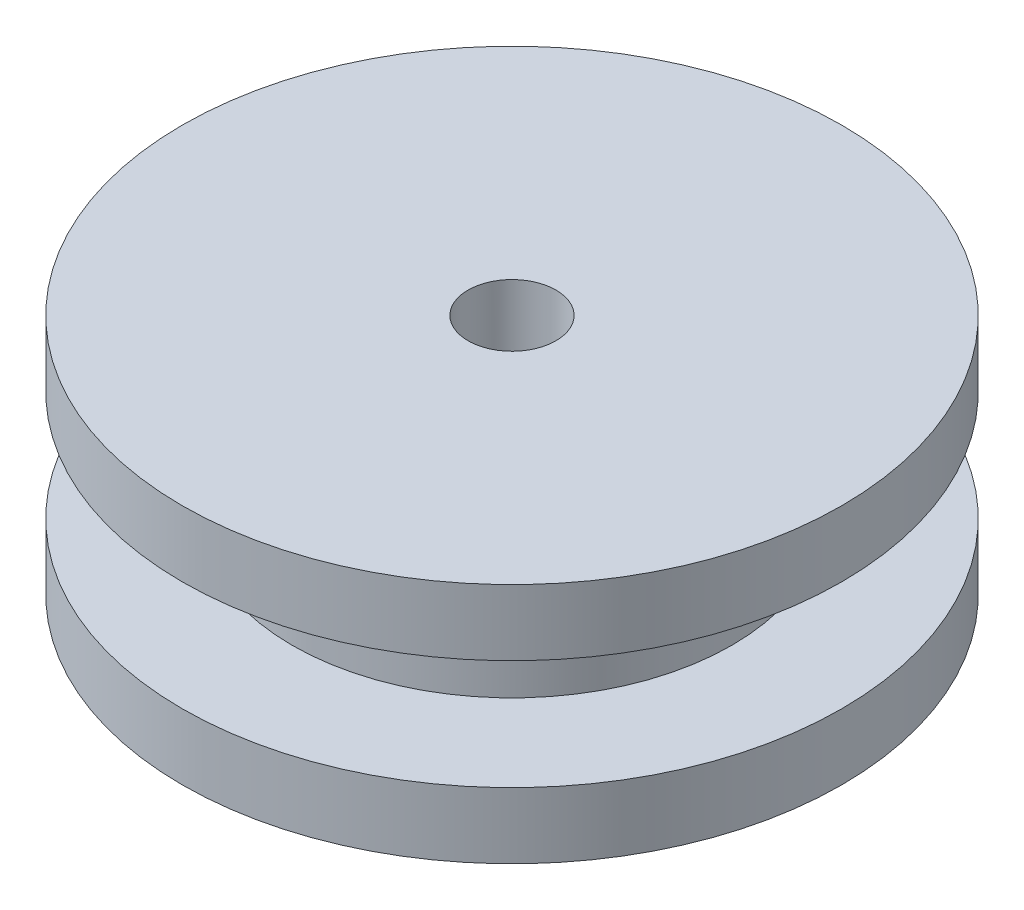
ISO-10303-21;
HEADER;
FILE_DESCRIPTION(('STEP AP214'),'2;1');
FILE_NAME('part.step','',(''),(''),'','','');
FILE_SCHEMA(('AUTOMOTIVE_DESIGN { 1 0 10303 214 1 1 1 1 }'));
ENDSEC;
DATA;
#1=APPLICATION_CONTEXT('core data for automotive mechanical design processes');
#2=APPLICATION_PROTOCOL_DEFINITION('international standard','automotive_design',2000,#1);
#3=PRODUCT_CONTEXT('',#1,'mechanical');
#4=PRODUCT('Part','Part','',(#3));
#5=PRODUCT_RELATED_PRODUCT_CATEGORY('part','',(#4));
#6=PRODUCT_DEFINITION_FORMATION('','',#4);
#7=PRODUCT_DEFINITION_CONTEXT('part definition',#1,'design');
#8=PRODUCT_DEFINITION('design','',#6,#7);
#9=PRODUCT_DEFINITION_SHAPE('','',#8);
#10=(LENGTH_UNIT() NAMED_UNIT(*) SI_UNIT(.MILLI.,.METRE.));
#11=(NAMED_UNIT(*) PLANE_ANGLE_UNIT() SI_UNIT($,.RADIAN.));
#12=(NAMED_UNIT(*) SI_UNIT($,.STERADIAN.) SOLID_ANGLE_UNIT());
#13=UNCERTAINTY_MEASURE_WITH_UNIT(LENGTH_MEASURE(1.E-05),#10,'distance_accuracy_value','');
#14=(GEOMETRIC_REPRESENTATION_CONTEXT(3) GLOBAL_UNCERTAINTY_ASSIGNED_CONTEXT((#13)) GLOBAL_UNIT_ASSIGNED_CONTEXT((#10,
#11,#12)) REPRESENTATION_CONTEXT('',''));
#15=CARTESIAN_POINT('',(0.,0.,0.));
#16=DIRECTION('',(0.,0.,1.));
#17=DIRECTION('',(1.,0.,0.));
#18=AXIS2_PLACEMENT_3D('',#15,#16,#17);
#19=CARTESIAN_POINT('',(0.,11.,0.));
#20=DIRECTION('',(0.,-1.,0.));
#21=DIRECTION('',(0.,0.,-1.));
#22=AXIS2_PLACEMENT_3D('',#19,#20,#21);
#23=CYLINDRICAL_SURFACE('',#22,15.);
#24=CARTESIAN_POINT('',(0.,11.,0.));
#25=DIRECTION('',(0.,1.,0.));
#26=DIRECTION('',(0.,0.,1.));
#27=AXIS2_PLACEMENT_3D('',#24,#25,#26);
#28=CIRCLE('',#27,15.);
#29=CARTESIAN_POINT('',(0.,11.,15.));
#30=VERTEX_POINT('',#29);
#31=EDGE_CURVE('E11',#30,#30,#28,.T.);
#32=ORIENTED_EDGE('',*,*,#31,.F.);
#33=EDGE_LOOP('',(#32));
#34=FACE_BOUND('',#33,.T.);
#35=CARTESIAN_POINT('',(0.,8.,0.));
#36=DIRECTION('',(0.,1.,0.));
#37=DIRECTION('',(0.,0.,1.));
#38=AXIS2_PLACEMENT_3D('',#35,#36,#37);
#39=CIRCLE('',#38,15.);
#40=CARTESIAN_POINT('',(0.,8.,15.));
#41=VERTEX_POINT('',#40);
#42=EDGE_CURVE('E48',#41,#41,#39,.T.);
#43=ORIENTED_EDGE('',*,*,#42,.T.);
#44=EDGE_LOOP('',(#43));
#45=FACE_BOUND('',#44,.T.);
#46=ADVANCED_FACE('F41',(#34,#45),#23,.T.);
#47=CARTESIAN_POINT('',(0.,11.,0.));
#48=DIRECTION('',(0.,1.,0.));
#49=DIRECTION('',(0.,0.,1.));
#50=AXIS2_PLACEMENT_3D('',#47,#48,#49);
#51=PLANE('',#50);
#52=CARTESIAN_POINT('',(0.,11.,0.));
#53=DIRECTION('',(0.,-1.,0.));
#54=DIRECTION('',(0.,0.,-1.));
#55=AXIS2_PLACEMENT_3D('',#52,#53,#54);
#56=CIRCLE('',#55,2.);
#57=CARTESIAN_POINT('',(0.,11.,-2.));
#58=VERTEX_POINT('',#57);
#59=EDGE_CURVE('E54',#58,#58,#56,.T.);
#60=ORIENTED_EDGE('',*,*,#59,.T.);
#61=EDGE_LOOP('',(#60));
#62=FACE_BOUND('',#61,.T.);
#63=ORIENTED_EDGE('',*,*,#31,.T.);
#64=EDGE_LOOP('',(#63));
#65=FACE_BOUND('',#64,.T.);
#66=ADVANCED_FACE('F71',(#62,#65),#51,.T.);
#67=CARTESIAN_POINT('',(0.,8.,0.));
#68=DIRECTION('',(0.,1.,0.));
#69=DIRECTION('',(0.,0.,1.));
#70=AXIS2_PLACEMENT_3D('',#67,#68,#69);
#71=PLANE('',#70);
#72=CARTESIAN_POINT('',(0.,8.,0.));
#73=DIRECTION('',(0.,1.,0.));
#74=DIRECTION('',(0.,0.,1.));
#75=AXIS2_PLACEMENT_3D('',#72,#73,#74);
#76=CIRCLE('',#75,2.);
#77=CARTESIAN_POINT('',(0.,8.,2.));
#78=VERTEX_POINT('',#77);
#79=EDGE_CURVE('E44',#78,#78,#76,.T.);
#80=ORIENTED_EDGE('',*,*,#79,.T.);
#81=EDGE_LOOP('',(#80));
#82=FACE_BOUND('',#81,.T.);
#83=ORIENTED_EDGE('',*,*,#42,.F.);
#84=EDGE_LOOP('',(#83));
#85=FACE_BOUND('',#84,.T.);
#86=ADVANCED_FACE('F61',(#82,#85),#71,.F.);
#87=CARTESIAN_POINT('',(0.,11.,0.));
#88=DIRECTION('',(0.,-1.,0.));
#89=DIRECTION('',(0.,0.,-1.));
#90=AXIS2_PLACEMENT_3D('',#87,#88,#89);
#91=CYLINDRICAL_SURFACE('',#90,2.);
#92=ORIENTED_EDGE('',*,*,#59,.F.);
#93=EDGE_LOOP('',(#92));
#94=FACE_BOUND('',#93,.T.);
#95=ORIENTED_EDGE('',*,*,#79,.F.);
#96=EDGE_LOOP('',(#95));
#97=FACE_BOUND('',#96,.T.);
#98=ADVANCED_FACE('F64',(#94,#97),#91,.F.);
#99=CLOSED_SHELL('',(#46,#66,#86,#98));
#100=MANIFOLD_SOLID_BREP('B2',#99);
#101=CARTESIAN_POINT('',(0.,3.,0.));
#102=DIRECTION('',(0.,-1.,0.));
#103=DIRECTION('',(0.,0.,-1.));
#104=AXIS2_PLACEMENT_3D('',#101,#102,#103);
#105=CYLINDRICAL_SURFACE('',#104,15.);
#106=CARTESIAN_POINT('',(0.,3.,0.));
#107=DIRECTION('',(0.,1.,0.));
#108=DIRECTION('',(0.,0.,1.));
#109=AXIS2_PLACEMENT_3D('',#106,#107,#108);
#110=CIRCLE('',#109,15.);
#111=CARTESIAN_POINT('',(0.,3.,15.));
#112=VERTEX_POINT('',#111);
#113=EDGE_CURVE('E110',#112,#112,#110,.T.);
#114=ORIENTED_EDGE('',*,*,#113,.F.);
#115=EDGE_LOOP('',(#114));
#116=FACE_BOUND('',#115,.T.);
#117=CARTESIAN_POINT('',(0.,0.,0.));
#118=DIRECTION('',(0.,1.,0.));
#119=DIRECTION('',(0.,0.,1.));
#120=AXIS2_PLACEMENT_3D('',#117,#118,#119);
#121=CIRCLE('',#120,15.);
#122=CARTESIAN_POINT('',(0.,0.,15.));
#123=VERTEX_POINT('',#122);
#124=EDGE_CURVE('E115',#123,#123,#121,.T.);
#125=ORIENTED_EDGE('',*,*,#124,.T.);
#126=EDGE_LOOP('',(#125));
#127=FACE_BOUND('',#126,.T.);
#128=ADVANCED_FACE('F103',(#116,#127),#105,.T.);
#129=CARTESIAN_POINT('',(0.,3.,0.));
#130=DIRECTION('',(0.,1.,0.));
#131=DIRECTION('',(0.,0.,1.));
#132=AXIS2_PLACEMENT_3D('',#129,#130,#131);
#133=PLANE('',#132);
#134=CARTESIAN_POINT('',(0.,3.,0.));
#135=DIRECTION('',(0.,1.,0.));
#136=DIRECTION('',(0.,0.,1.));
#137=AXIS2_PLACEMENT_3D('',#134,#135,#136);
#138=CIRCLE('',#137,10.);
#139=CARTESIAN_POINT('',(0.,3.,10.));
#140=VERTEX_POINT('',#139);
#141=EDGE_CURVE('E40',#140,#140,#138,.T.);
#142=ORIENTED_EDGE('',*,*,#141,.F.);
#143=EDGE_LOOP('',(#142));
#144=FACE_BOUND('',#143,.T.);
#145=ORIENTED_EDGE('',*,*,#113,.T.);
#146=EDGE_LOOP('',(#145));
#147=FACE_BOUND('',#146,.T.);
#148=ADVANCED_FACE('F139',(#144,#147),#133,.T.);
#149=CARTESIAN_POINT('',(0.,0.,0.));
#150=DIRECTION('',(0.,1.,0.));
#151=DIRECTION('',(0.,0.,1.));
#152=AXIS2_PLACEMENT_3D('',#149,#150,#151);
#153=PLANE('',#152);
#154=CARTESIAN_POINT('',(0.,0.,0.));
#155=DIRECTION('',(0.,-1.,0.));
#156=DIRECTION('',(0.,0.,-1.));
#157=AXIS2_PLACEMENT_3D('',#154,#155,#156);
#158=CIRCLE('',#157,2.);
#159=CARTESIAN_POINT('',(0.,0.,-2.));
#160=VERTEX_POINT('',#159);
#161=EDGE_CURVE('E127',#160,#160,#158,.T.);
#162=ORIENTED_EDGE('',*,*,#161,.F.);
#163=EDGE_LOOP('',(#162));
#164=FACE_BOUND('',#163,.T.);
#165=ORIENTED_EDGE('',*,*,#124,.F.);
#166=EDGE_LOOP('',(#165));
#167=FACE_BOUND('',#166,.T.);
#168=ADVANCED_FACE('F135',(#164,#167),#153,.F.);
#169=CARTESIAN_POINT('',(0.,8.,0.));
#170=DIRECTION('',(0.,-1.,0.));
#171=DIRECTION('',(0.,0.,-1.));
#172=AXIS2_PLACEMENT_3D('',#169,#170,#171);
#173=CYLINDRICAL_SURFACE('',#172,10.);
#174=CARTESIAN_POINT('',(0.,8.,0.));
#175=DIRECTION('',(0.,1.,0.));
#176=DIRECTION('',(0.,0.,1.));
#177=AXIS2_PLACEMENT_3D('',#174,#175,#176);
#178=CIRCLE('',#177,10.);
#179=CARTESIAN_POINT('',(0.,8.,10.));
#180=VERTEX_POINT('',#179);
#181=EDGE_CURVE('E118',#180,#180,#178,.T.);
#182=ORIENTED_EDGE('',*,*,#181,.F.);
#183=EDGE_LOOP('',(#182));
#184=FACE_BOUND('',#183,.T.);
#185=ORIENTED_EDGE('',*,*,#141,.T.);
#186=EDGE_LOOP('',(#185));
#187=FACE_BOUND('',#186,.T.);
#188=ADVANCED_FACE('F138',(#184,#187),#173,.T.);
#189=CARTESIAN_POINT('',(0.,8.,0.));
#190=DIRECTION('',(0.,1.,0.));
#191=DIRECTION('',(0.,0.,1.));
#192=AXIS2_PLACEMENT_3D('',#189,#190,#191);
#193=PLANE('',#192);
#194=CARTESIAN_POINT('',(0.,8.,0.));
#195=DIRECTION('',(0.,1.,0.));
#196=DIRECTION('',(0.,0.,1.));
#197=AXIS2_PLACEMENT_3D('',#194,#195,#196);
#198=CIRCLE('',#197,2.);
#199=CARTESIAN_POINT('',(0.,8.,2.));
#200=VERTEX_POINT('',#199);
#201=EDGE_CURVE('E106',#200,#200,#198,.T.);
#202=ORIENTED_EDGE('',*,*,#201,.F.);
#203=EDGE_LOOP('',(#202));
#204=FACE_BOUND('',#203,.T.);
#205=ORIENTED_EDGE('',*,*,#181,.T.);
#206=EDGE_LOOP('',(#205));
#207=FACE_BOUND('',#206,.T.);
#208=ADVANCED_FACE('F144',(#204,#207),#193,.T.);
#209=CARTESIAN_POINT('',(0.,11.,0.));
#210=DIRECTION('',(0.,-1.,0.));
#211=DIRECTION('',(0.,0.,-1.));
#212=AXIS2_PLACEMENT_3D('',#209,#210,#211);
#213=CYLINDRICAL_SURFACE('',#212,2.);
#214=ORIENTED_EDGE('',*,*,#201,.T.);
#215=EDGE_LOOP('',(#214));
#216=FACE_BOUND('',#215,.T.);
#217=ORIENTED_EDGE('',*,*,#161,.T.);
#218=EDGE_LOOP('',(#217));
#219=FACE_BOUND('',#218,.T.);
#220=ADVANCED_FACE('F133',(#216,#219),#213,.F.);
#221=CLOSED_SHELL('',(#128,#148,#168,#188,#208,#220));
#222=MANIFOLD_SOLID_BREP('B6',#221);
#223=ADVANCED_BREP_SHAPE_REPRESENTATION('',(#18,#100,#222),#14);
#224=SHAPE_DEFINITION_REPRESENTATION(#9,#223);
ENDSEC;
END-ISO-10303-21;
